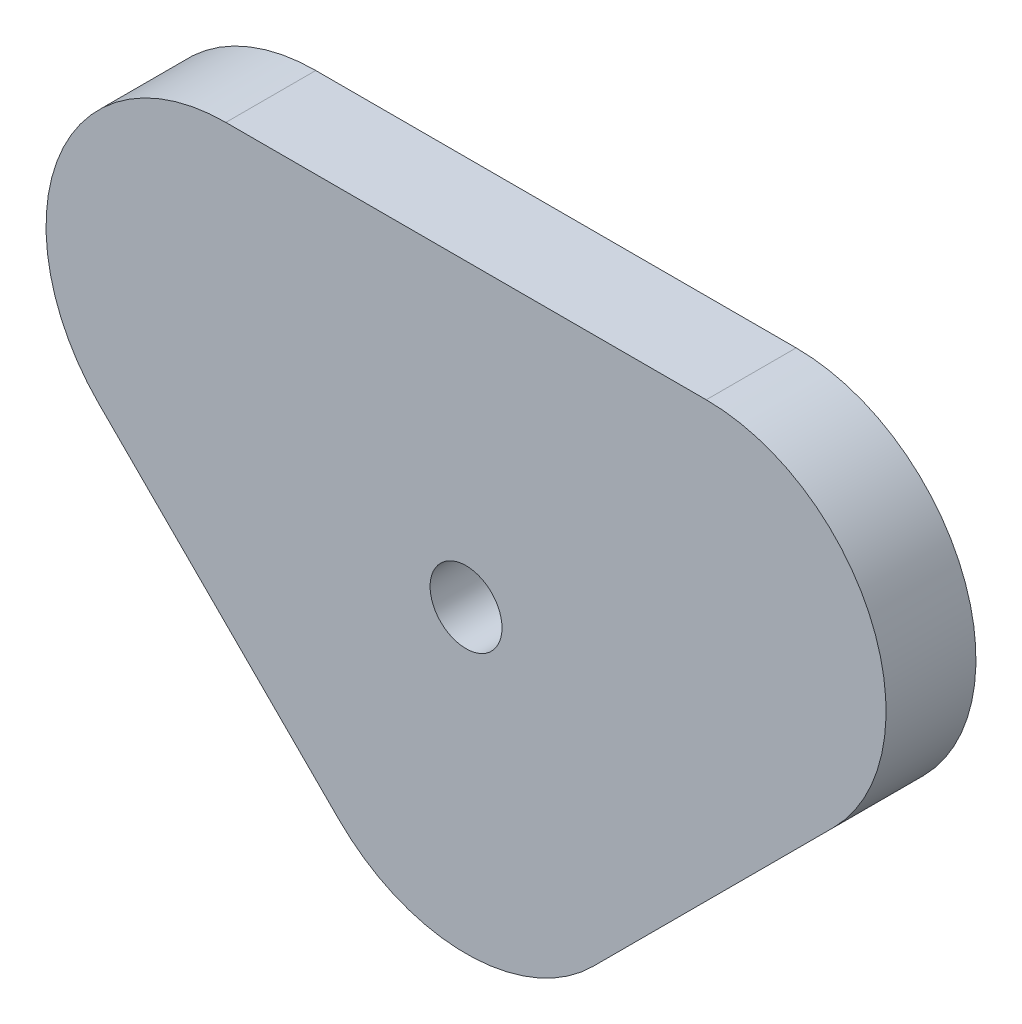
ISO-10303-21;
HEADER;
FILE_DESCRIPTION(('STEP AP214'),'2;1');
FILE_NAME('part.step','',(''),(''),'','','');
FILE_SCHEMA(('AUTOMOTIVE_DESIGN { 1 0 10303 214 1 1 1 1 }'));
ENDSEC;
DATA;
#1=APPLICATION_CONTEXT('core data for automotive mechanical design processes');
#2=APPLICATION_PROTOCOL_DEFINITION('international standard','automotive_design',2000,#1);
#3=PRODUCT_CONTEXT('',#1,'mechanical');
#4=PRODUCT('Part','Part','',(#3));
#5=PRODUCT_RELATED_PRODUCT_CATEGORY('part','',(#4));
#6=PRODUCT_DEFINITION_FORMATION('','',#4);
#7=PRODUCT_DEFINITION_CONTEXT('part definition',#1,'design');
#8=PRODUCT_DEFINITION('design','',#6,#7);
#9=PRODUCT_DEFINITION_SHAPE('','',#8);
#10=(LENGTH_UNIT() NAMED_UNIT(*) SI_UNIT(.MILLI.,.METRE.));
#11=(NAMED_UNIT(*) PLANE_ANGLE_UNIT() SI_UNIT($,.RADIAN.));
#12=(NAMED_UNIT(*) SI_UNIT($,.STERADIAN.) SOLID_ANGLE_UNIT());
#13=UNCERTAINTY_MEASURE_WITH_UNIT(LENGTH_MEASURE(1.E-05),#10,'distance_accuracy_value','');
#14=(GEOMETRIC_REPRESENTATION_CONTEXT(3) GLOBAL_UNCERTAINTY_ASSIGNED_CONTEXT((#13)) GLOBAL_UNIT_ASSIGNED_CONTEXT((#10,
#11,#12)) REPRESENTATION_CONTEXT('',''));
#15=CARTESIAN_POINT('',(0.,0.,0.));
#16=DIRECTION('',(0.,0.,1.));
#17=DIRECTION('',(1.,0.,0.));
#18=AXIS2_PLACEMENT_3D('',#15,#16,#17);
#19=CARTESIAN_POINT('',(-508.970562748496,593.,0.));
#20=DIRECTION('',(0.,0.,1.));
#21=DIRECTION('',(1.,0.,0.));
#22=AXIS2_PLACEMENT_3D('',#19,#20,#21);
#23=PLANE('',#22);
#24=CARTESIAN_POINT('',(-525.000000000019,576.970562748477,0.));
#25=DIRECTION('',(0.,0.,1.));
#26=DIRECTION('',(1.,0.,0.));
#27=AXIS2_PLACEMENT_3D('',#24,#25,#26);
#28=CIRCLE('',#27,12.0000000000003);
#29=CARTESIAN_POINT('',(-516.51471862578,568.485281374239,0.));
#30=VERTEX_POINT('',#29);
#31=CARTESIAN_POINT('',(-533.485281374258,568.485281374239,0.));
#32=VERTEX_POINT('',#31);
#33=EDGE_CURVE('E112',#30,#32,#28,.F.);
#34=ORIENTED_EDGE('',*,*,#33,.F.);
#35=DIRECTION('',(0.707106781186548,0.707106781186548,0.));
#36=VECTOR('',#35,1.);
#37=CARTESIAN_POINT('',(-516.51471862578,568.485281374239,0.));
#38=LINE('',#37,#36);
#39=CARTESIAN_POINT('',(-500.485281374257,584.514718625762,0.));
#40=VERTEX_POINT('',#39);
#41=EDGE_CURVE('E78',#40,#30,#38,.F.);
#42=ORIENTED_EDGE('',*,*,#41,.F.);
#43=CARTESIAN_POINT('',(-508.970562748496,593.,0.));
#44=DIRECTION('',(0.,0.,1.));
#45=DIRECTION('',(1.,0.,0.));
#46=AXIS2_PLACEMENT_3D('',#43,#44,#45);
#47=CIRCLE('',#46,12.0000000000001);
#48=CARTESIAN_POINT('',(-508.970562748496,605.,0.));
#49=VERTEX_POINT('',#48);
#50=EDGE_CURVE('E72',#49,#40,#47,.F.);
#51=ORIENTED_EDGE('',*,*,#50,.F.);
#52=DIRECTION('',(1.,0.,0.));
#53=VECTOR('',#52,1.);
#54=CARTESIAN_POINT('',(-508.970562748496,605.,0.));
#55=LINE('',#54,#53);
#56=CARTESIAN_POINT('',(-541.029437251542,605.,0.));
#57=VERTEX_POINT('',#56);
#58=EDGE_CURVE('E76',#57,#49,#55,.T.);
#59=ORIENTED_EDGE('',*,*,#58,.F.);
#60=CARTESIAN_POINT('',(-541.029437251541,593.,0.));
#61=DIRECTION('',(0.,0.,1.));
#62=DIRECTION('',(1.,0.,0.));
#63=AXIS2_PLACEMENT_3D('',#60,#61,#62);
#64=CIRCLE('',#63,12.0000000000003);
#65=CARTESIAN_POINT('',(-549.514718625781,584.514718625761,0.));
#66=VERTEX_POINT('',#65);
#67=EDGE_CURVE('E67',#66,#57,#64,.F.);
#68=ORIENTED_EDGE('',*,*,#67,.F.);
#69=DIRECTION('',(0.707106781186548,-0.707106781186548,0.));
#70=VECTOR('',#69,1.);
#71=CARTESIAN_POINT('',(-549.514718625781,584.514718625762,0.));
#72=LINE('',#71,#70);
#73=EDGE_CURVE('E98',#32,#66,#72,.F.);
#74=ORIENTED_EDGE('',*,*,#73,.F.);
#75=EDGE_LOOP('',(#34,#42,#51,#59,#68,#74));
#76=FACE_BOUND('',#75,.T.);
#77=CARTESIAN_POINT('',(-525.000000000019,585.,0.));
#78=DIRECTION('',(0.,0.,1.));
#79=DIRECTION('',(1.,0.,0.));
#80=AXIS2_PLACEMENT_3D('',#77,#78,#79);
#81=CIRCLE('',#80,2.40000000001839);
#82=CARTESIAN_POINT('',(-522.6,585.,0.));
#83=VERTEX_POINT('',#82);
#84=EDGE_CURVE('E19',#83,#83,#81,.F.);
#85=ORIENTED_EDGE('',*,*,#84,.T.);
#86=EDGE_LOOP('',(#85));
#87=FACE_BOUND('',#86,.T.);
#88=ADVANCED_FACE('F16',(#76,#87),#23,.T.);
#89=CARTESIAN_POINT('',(-525.000000000019,585.,-6.00000000000001));
#90=DIRECTION('',(0.,0.,1.));
#91=DIRECTION('',(1.,0.,0.));
#92=AXIS2_PLACEMENT_3D('',#89,#90,#91);
#93=CYLINDRICAL_SURFACE('',#92,2.40000000001839);
#94=CARTESIAN_POINT('',(-525.000000000019,585.,-6.00000000000001));
#95=DIRECTION('',(0.,0.,1.));
#96=DIRECTION('',(1.,0.,0.));
#97=AXIS2_PLACEMENT_3D('',#94,#95,#96);
#98=CIRCLE('',#97,2.40000000001839);
#99=CARTESIAN_POINT('',(-522.6,585.,-6.00000000000001));
#100=VERTEX_POINT('',#99);
#101=EDGE_CURVE('E109',#100,#100,#98,.F.);
#102=ORIENTED_EDGE('',*,*,#101,.T.);
#103=EDGE_LOOP('',(#102));
#104=FACE_BOUND('',#103,.T.);
#105=ORIENTED_EDGE('',*,*,#84,.F.);
#106=EDGE_LOOP('',(#105));
#107=FACE_BOUND('',#106,.T.);
#108=ADVANCED_FACE('F141',(#104,#107),#93,.F.);
#109=CARTESIAN_POINT('',(-508.970562748496,605.,-6.00000000000001));
#110=DIRECTION('',(0.,1.,0.));
#111=DIRECTION('',(0.,0.,1.));
#112=AXIS2_PLACEMENT_3D('',#109,#110,#111);
#113=PLANE('',#112);
#114=DIRECTION('',(1.,0.,0.));
#115=VECTOR('',#114,1.);
#116=CARTESIAN_POINT('',(-508.970562748496,605.,-6.00000000000001));
#117=LINE('',#116,#115);
#118=CARTESIAN_POINT('',(-508.970562748496,605.,-6.00000000000001));
#119=VERTEX_POINT('',#118);
#120=CARTESIAN_POINT('',(-541.029437251542,605.,-6.00000000000001));
#121=VERTEX_POINT('',#120);
#122=EDGE_CURVE('E107',#119,#121,#117,.F.);
#123=ORIENTED_EDGE('',*,*,#122,.T.);
#124=DIRECTION('',(0.,0.,1.));
#125=VECTOR('',#124,1.);
#126=CARTESIAN_POINT('',(-541.029437251542,605.,-6.00000000000001));
#127=LINE('',#126,#125);
#128=EDGE_CURVE('E89',#57,#121,#127,.F.);
#129=ORIENTED_EDGE('',*,*,#128,.F.);
#130=ORIENTED_EDGE('',*,*,#58,.T.);
#131=DIRECTION('',(0.,0.,1.));
#132=VECTOR('',#131,1.);
#133=CARTESIAN_POINT('',(-508.970562748496,605.,-6.00000000000001));
#134=LINE('',#133,#132);
#135=EDGE_CURVE('E88',#49,#119,#134,.F.);
#136=ORIENTED_EDGE('',*,*,#135,.T.);
#137=EDGE_LOOP('',(#123,#129,#130,#136));
#138=FACE_BOUND('',#137,.T.);
#139=ADVANCED_FACE('F87',(#138),#113,.T.);
#140=CARTESIAN_POINT('',(-541.029437251541,593.,-6.00000000000001));
#141=DIRECTION('',(0.,0.,1.));
#142=DIRECTION('',(1.,0.,0.));
#143=AXIS2_PLACEMENT_3D('',#140,#141,#142);
#144=CYLINDRICAL_SURFACE('',#143,12.0000000000003);
#145=CARTESIAN_POINT('',(-541.029437251541,593.,-6.00000000000001));
#146=DIRECTION('',(0.,0.,1.));
#147=DIRECTION('',(1.,0.,0.));
#148=AXIS2_PLACEMENT_3D('',#145,#146,#147);
#149=CIRCLE('',#148,12.0000000000003);
#150=CARTESIAN_POINT('',(-549.51471862578,584.514718625761,-6.00000000000001));
#151=VERTEX_POINT('',#150);
#152=EDGE_CURVE('E104',#121,#151,#149,.T.);
#153=ORIENTED_EDGE('',*,*,#152,.T.);
#154=DIRECTION('',(0.,0.,1.));
#155=VECTOR('',#154,1.);
#156=CARTESIAN_POINT('',(-549.514718625781,584.514718625762,-6.00000000000001));
#157=LINE('',#156,#155);
#158=EDGE_CURVE('E99',#66,#151,#157,.F.);
#159=ORIENTED_EDGE('',*,*,#158,.F.);
#160=ORIENTED_EDGE('',*,*,#67,.T.);
#161=ORIENTED_EDGE('',*,*,#128,.T.);
#162=EDGE_LOOP('',(#153,#159,#160,#161));
#163=FACE_BOUND('',#162,.T.);
#164=ADVANCED_FACE('F130',(#163),#144,.T.);
#165=CARTESIAN_POINT('',(-549.514718625781,584.514718625762,-6.00000000000001));
#166=DIRECTION('',(-0.707106781186548,-0.707106781186548,0.));
#167=DIRECTION('',(0.707106781186548,-0.707106781186548,0.));
#168=AXIS2_PLACEMENT_3D('',#165,#166,#167);
#169=PLANE('',#168);
#170=DIRECTION('',(0.707106781186555,-0.70710678118654,0.));
#171=VECTOR('',#170,1.);
#172=CARTESIAN_POINT('',(-549.514718625781,584.514718625762,-6.00000000000001));
#173=LINE('',#172,#171);
#174=CARTESIAN_POINT('',(-533.485281374258,568.485281374239,-6.00000000000001));
#175=VERTEX_POINT('',#174);
#176=EDGE_CURVE('E103',#151,#175,#173,.T.);
#177=ORIENTED_EDGE('',*,*,#176,.T.);
#178=DIRECTION('',(0.,0.,1.));
#179=VECTOR('',#178,1.);
#180=CARTESIAN_POINT('',(-533.485281374258,568.485281374239,-6.00000000000001));
#181=LINE('',#180,#179);
#182=EDGE_CURVE('E97',#32,#175,#181,.F.);
#183=ORIENTED_EDGE('',*,*,#182,.F.);
#184=ORIENTED_EDGE('',*,*,#73,.T.);
#185=ORIENTED_EDGE('',*,*,#158,.T.);
#186=EDGE_LOOP('',(#177,#183,#184,#185));
#187=FACE_BOUND('',#186,.T.);
#188=ADVANCED_FACE('F125',(#187),#169,.T.);
#189=CARTESIAN_POINT('',(-525.000000000019,576.970562748477,-6.00000000000001));
#190=DIRECTION('',(0.,0.,1.));
#191=DIRECTION('',(1.,0.,0.));
#192=AXIS2_PLACEMENT_3D('',#189,#190,#191);
#193=CYLINDRICAL_SURFACE('',#192,12.0000000000003);
#194=CARTESIAN_POINT('',(-525.000000000019,576.970562748477,-6.00000000000001));
#195=DIRECTION('',(0.,0.,1.));
#196=DIRECTION('',(1.,0.,0.));
#197=AXIS2_PLACEMENT_3D('',#194,#195,#196);
#198=CIRCLE('',#197,12.0000000000003);
#199=CARTESIAN_POINT('',(-516.51471862578,568.485281374239,-6.00000000000001));
#200=VERTEX_POINT('',#199);
#201=EDGE_CURVE('E25',#175,#200,#198,.T.);
#202=ORIENTED_EDGE('',*,*,#201,.T.);
#203=DIRECTION('',(0.,0.,1.));
#204=VECTOR('',#203,1.);
#205=CARTESIAN_POINT('',(-516.51471862578,568.485281374239,-6.00000000000001));
#206=LINE('',#205,#204);
#207=EDGE_CURVE('E83',#30,#200,#206,.F.);
#208=ORIENTED_EDGE('',*,*,#207,.F.);
#209=ORIENTED_EDGE('',*,*,#33,.T.);
#210=ORIENTED_EDGE('',*,*,#182,.T.);
#211=EDGE_LOOP('',(#202,#208,#209,#210));
#212=FACE_BOUND('',#211,.T.);
#213=ADVANCED_FACE('F139',(#212),#193,.T.);
#214=CARTESIAN_POINT('',(-516.51471862578,568.485281374239,-6.00000000000001));
#215=DIRECTION('',(0.707106781186548,-0.707106781186548,0.));
#216=DIRECTION('',(0.707106781186548,0.707106781186548,0.));
#217=AXIS2_PLACEMENT_3D('',#214,#215,#216);
#218=PLANE('',#217);
#219=DIRECTION('',(0.707106781186548,0.707106781186548,0.));
#220=VECTOR('',#219,1.);
#221=CARTESIAN_POINT('',(-516.51471862578,568.485281374239,-6.00000000000001));
#222=LINE('',#221,#220);
#223=CARTESIAN_POINT('',(-500.485281374257,584.514718625762,-6.00000000000001));
#224=VERTEX_POINT('',#223);
#225=EDGE_CURVE('E11',#200,#224,#222,.T.);
#226=ORIENTED_EDGE('',*,*,#225,.T.);
#227=DIRECTION('',(0.,0.,1.));
#228=VECTOR('',#227,1.);
#229=CARTESIAN_POINT('',(-500.485281374257,584.514718625761,-6.00000000000001));
#230=LINE('',#229,#228);
#231=EDGE_CURVE('E82',#40,#224,#230,.F.);
#232=ORIENTED_EDGE('',*,*,#231,.F.);
#233=ORIENTED_EDGE('',*,*,#41,.T.);
#234=ORIENTED_EDGE('',*,*,#207,.T.);
#235=EDGE_LOOP('',(#226,#232,#233,#234));
#236=FACE_BOUND('',#235,.T.);
#237=ADVANCED_FACE('F149',(#236),#218,.T.);
#238=CARTESIAN_POINT('',(-508.970562748496,593.,-6.00000000000001));
#239=DIRECTION('',(0.,0.,1.));
#240=DIRECTION('',(1.,0.,0.));
#241=AXIS2_PLACEMENT_3D('',#238,#239,#240);
#242=CYLINDRICAL_SURFACE('',#241,12.0000000000001);
#243=ORIENTED_EDGE('',*,*,#50,.T.);
#244=ORIENTED_EDGE('',*,*,#231,.T.);
#245=CARTESIAN_POINT('',(-508.970562748496,593.,-6.00000000000001));
#246=DIRECTION('',(0.,0.,1.));
#247=DIRECTION('',(1.,0.,0.));
#248=AXIS2_PLACEMENT_3D('',#245,#246,#247);
#249=CIRCLE('',#248,12.0000000000001);
#250=EDGE_CURVE('E34',#224,#119,#249,.T.);
#251=ORIENTED_EDGE('',*,*,#250,.T.);
#252=ORIENTED_EDGE('',*,*,#135,.F.);
#253=EDGE_LOOP('',(#243,#244,#251,#252));
#254=FACE_BOUND('',#253,.T.);
#255=ADVANCED_FACE('F91',(#254),#242,.T.);
#256=CARTESIAN_POINT('',(-508.970562748496,593.,-6.00000000000001));
#257=DIRECTION('',(0.,0.,1.));
#258=DIRECTION('',(1.,0.,0.));
#259=AXIS2_PLACEMENT_3D('',#256,#257,#258);
#260=PLANE('',#259);
#261=ORIENTED_EDGE('',*,*,#225,.F.);
#262=ORIENTED_EDGE('',*,*,#201,.F.);
#263=ORIENTED_EDGE('',*,*,#176,.F.);
#264=ORIENTED_EDGE('',*,*,#152,.F.);
#265=ORIENTED_EDGE('',*,*,#122,.F.);
#266=ORIENTED_EDGE('',*,*,#250,.F.);
#267=EDGE_LOOP('',(#261,#262,#263,#264,#265,#266));
#268=FACE_BOUND('',#267,.T.);
#269=ORIENTED_EDGE('',*,*,#101,.F.);
#270=EDGE_LOOP('',(#269));
#271=FACE_BOUND('',#270,.T.);
#272=ADVANCED_FACE('F128',(#268,#271),#260,.F.);
#273=CLOSED_SHELL('',(#88,#108,#139,#164,#188,#213,#237,#255,#272));
#274=MANIFOLD_SOLID_BREP('B1',#273);
#275=ADVANCED_BREP_SHAPE_REPRESENTATION('',(#18,#274),#14);
#276=SHAPE_DEFINITION_REPRESENTATION(#9,#275);
ENDSEC;
END-ISO-10303-21;
